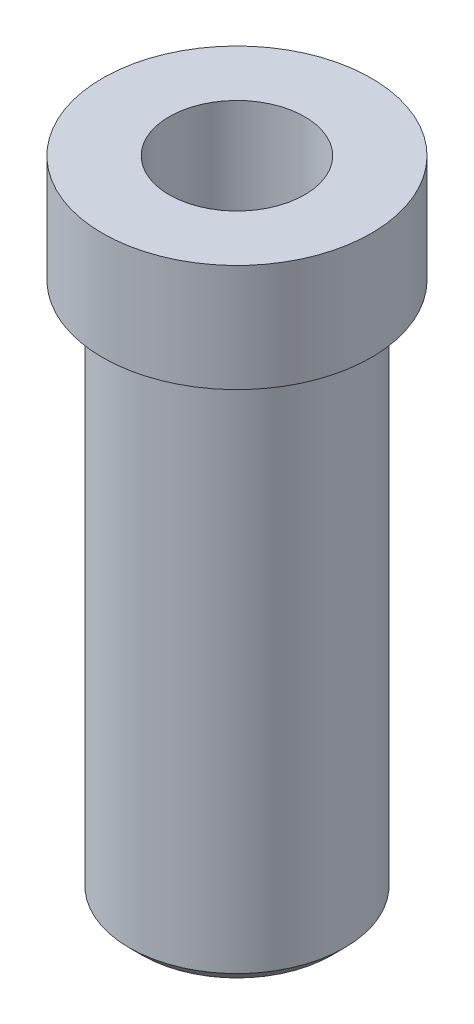
ISO-10303-21;
HEADER;
FILE_DESCRIPTION(('STEP AP214'),'2;1');
FILE_NAME('part.step','',(''),(''),'','','');
FILE_SCHEMA(('AUTOMOTIVE_DESIGN { 1 0 10303 214 1 1 1 1 }'));
ENDSEC;
DATA;
#1=APPLICATION_CONTEXT('core data for automotive mechanical design processes');
#2=APPLICATION_PROTOCOL_DEFINITION('international standard','automotive_design',2000,#1);
#3=PRODUCT_CONTEXT('',#1,'mechanical');
#4=PRODUCT('Part','Part','',(#3));
#5=PRODUCT_RELATED_PRODUCT_CATEGORY('part','',(#4));
#6=PRODUCT_DEFINITION_FORMATION('','',#4);
#7=PRODUCT_DEFINITION_CONTEXT('part definition',#1,'design');
#8=PRODUCT_DEFINITION('design','',#6,#7);
#9=PRODUCT_DEFINITION_SHAPE('','',#8);
#10=(LENGTH_UNIT() NAMED_UNIT(*) SI_UNIT(.MILLI.,.METRE.));
#11=(NAMED_UNIT(*) PLANE_ANGLE_UNIT() SI_UNIT($,.RADIAN.));
#12=(NAMED_UNIT(*) SI_UNIT($,.STERADIAN.) SOLID_ANGLE_UNIT());
#13=UNCERTAINTY_MEASURE_WITH_UNIT(LENGTH_MEASURE(1.E-05),#10,'distance_accuracy_value','');
#14=(GEOMETRIC_REPRESENTATION_CONTEXT(3) GLOBAL_UNCERTAINTY_ASSIGNED_CONTEXT((#13)) GLOBAL_UNIT_ASSIGNED_CONTEXT((#10,
#11,#12)) REPRESENTATION_CONTEXT('',''));
#15=CARTESIAN_POINT('',(0.,0.,0.));
#16=DIRECTION('',(0.,0.,1.));
#17=DIRECTION('',(1.,0.,0.));
#18=AXIS2_PLACEMENT_3D('',#15,#16,#17);
#19=CARTESIAN_POINT('',(0.,2.5,0.));
#20=DIRECTION('',(0.,-1.,0.));
#21=DIRECTION('',(0.,0.,-1.));
#22=AXIS2_PLACEMENT_3D('',#19,#20,#21);
#23=CYLINDRICAL_SURFACE('',#22,0.5);
#24=CARTESIAN_POINT('',(0.,0.0600000000000002,0.));
#25=DIRECTION('',(0.,1.,0.));
#26=DIRECTION('',(0.,0.,1.));
#27=AXIS2_PLACEMENT_3D('',#24,#25,#26);
#28=CIRCLE('',#27,0.5);
#29=CARTESIAN_POINT('',(0.,0.0600000000000002,0.5));
#30=VERTEX_POINT('',#29);
#31=EDGE_CURVE('E45',#30,#30,#28,.T.);
#32=ORIENTED_EDGE('',*,*,#31,.T.);
#33=EDGE_LOOP('',(#32));
#34=FACE_BOUND('',#33,.T.);
#35=CARTESIAN_POINT('',(0.,2.5,0.));
#36=DIRECTION('',(0.,1.,0.));
#37=DIRECTION('',(0.,0.,1.));
#38=AXIS2_PLACEMENT_3D('',#35,#36,#37);
#39=CIRCLE('',#38,0.5);
#40=CARTESIAN_POINT('',(0.,2.5,0.5));
#41=VERTEX_POINT('',#40);
#42=EDGE_CURVE('E49',#41,#41,#39,.T.);
#43=ORIENTED_EDGE('',*,*,#42,.F.);
#44=EDGE_LOOP('',(#43));
#45=FACE_BOUND('',#44,.T.);
#46=ADVANCED_FACE('F37',(#34,#45),#23,.T.);
#47=CARTESIAN_POINT('',(0.,0.,0.));
#48=DIRECTION('',(0.,1.,0.));
#49=DIRECTION('',(0.,0.,1.));
#50=AXIS2_PLACEMENT_3D('',#47,#48,#49);
#51=PLANE('',#50);
#52=CARTESIAN_POINT('',(0.,0.,0.));
#53=DIRECTION('',(0.,1.,0.));
#54=DIRECTION('',(0.,0.,1.));
#55=AXIS2_PLACEMENT_3D('',#52,#53,#54);
#56=CIRCLE('',#55,0.44);
#57=CARTESIAN_POINT('',(0.,0.,0.44));
#58=VERTEX_POINT('',#57);
#59=EDGE_CURVE('E10',#58,#58,#56,.F.);
#60=ORIENTED_EDGE('',*,*,#59,.T.);
#61=EDGE_LOOP('',(#60));
#62=FACE_BOUND('',#61,.T.);
#63=CARTESIAN_POINT('',(0.,0.,0.));
#64=DIRECTION('',(0.,1.,0.));
#65=DIRECTION('',(0.,0.,1.));
#66=AXIS2_PLACEMENT_3D('',#63,#64,#65);
#67=CIRCLE('',#66,0.314999999999997);
#68=CARTESIAN_POINT('',(0.,0.,0.314999999999997));
#69=VERTEX_POINT('',#68);
#70=EDGE_CURVE('E59',#69,#69,#67,.T.);
#71=ORIENTED_EDGE('',*,*,#70,.T.);
#72=EDGE_LOOP('',(#71));
#73=FACE_BOUND('',#72,.T.);
#74=ADVANCED_FACE('F80',(#62,#73),#51,.F.);
#75=CARTESIAN_POINT('',(0.,3.,0.));
#76=DIRECTION('',(0.,-1.,0.));
#77=DIRECTION('',(0.,0.,-1.));
#78=AXIS2_PLACEMENT_3D('',#75,#76,#77);
#79=CYLINDRICAL_SURFACE('',#78,0.625);
#80=CARTESIAN_POINT('',(0.,3.,0.));
#81=DIRECTION('',(0.,1.,0.));
#82=DIRECTION('',(0.,0.,1.));
#83=AXIS2_PLACEMENT_3D('',#80,#81,#82);
#84=CIRCLE('',#83,0.625);
#85=CARTESIAN_POINT('',(0.,3.,0.625));
#86=VERTEX_POINT('',#85);
#87=EDGE_CURVE('E53',#86,#86,#84,.T.);
#88=ORIENTED_EDGE('',*,*,#87,.F.);
#89=EDGE_LOOP('',(#88));
#90=FACE_BOUND('',#89,.T.);
#91=CARTESIAN_POINT('',(0.,2.5,0.));
#92=DIRECTION('',(0.,1.,0.));
#93=DIRECTION('',(0.,0.,1.));
#94=AXIS2_PLACEMENT_3D('',#91,#92,#93);
#95=CIRCLE('',#94,0.625);
#96=CARTESIAN_POINT('',(0.,2.5,0.625));
#97=VERTEX_POINT('',#96);
#98=EDGE_CURVE('E56',#97,#97,#95,.T.);
#99=ORIENTED_EDGE('',*,*,#98,.T.);
#100=EDGE_LOOP('',(#99));
#101=FACE_BOUND('',#100,.T.);
#102=ADVANCED_FACE('F74',(#90,#101),#79,.T.);
#103=CARTESIAN_POINT('',(0.,3.,0.));
#104=DIRECTION('',(0.,1.,0.));
#105=DIRECTION('',(0.,0.,1.));
#106=AXIS2_PLACEMENT_3D('',#103,#104,#105);
#107=PLANE('',#106);
#108=CARTESIAN_POINT('',(0.,3.,0.));
#109=DIRECTION('',(0.,1.,0.));
#110=DIRECTION('',(0.,0.,1.));
#111=AXIS2_PLACEMENT_3D('',#108,#109,#110);
#112=CIRCLE('',#111,0.314999999999987);
#113=CARTESIAN_POINT('',(0.,3.,0.314999999999987));
#114=VERTEX_POINT('',#113);
#115=EDGE_CURVE('E64',#114,#114,#112,.T.);
#116=ORIENTED_EDGE('',*,*,#115,.F.);
#117=EDGE_LOOP('',(#116));
#118=FACE_BOUND('',#117,.T.);
#119=ORIENTED_EDGE('',*,*,#87,.T.);
#120=EDGE_LOOP('',(#119));
#121=FACE_BOUND('',#120,.T.);
#122=ADVANCED_FACE('F70',(#118,#121),#107,.T.);
#123=CARTESIAN_POINT('',(0.,2.5,0.));
#124=DIRECTION('',(0.,1.,0.));
#125=DIRECTION('',(0.,0.,1.));
#126=AXIS2_PLACEMENT_3D('',#123,#124,#125);
#127=PLANE('',#126);
#128=ORIENTED_EDGE('',*,*,#42,.T.);
#129=EDGE_LOOP('',(#128));
#130=FACE_BOUND('',#129,.T.);
#131=ORIENTED_EDGE('',*,*,#98,.F.);
#132=EDGE_LOOP('',(#131));
#133=FACE_BOUND('',#132,.T.);
#134=ADVANCED_FACE('F73',(#130,#133),#127,.F.);
#135=CARTESIAN_POINT('',(0.,3.,0.));
#136=DIRECTION('',(0.,1.,0.));
#137=DIRECTION('',(0.,0.,1.));
#138=AXIS2_PLACEMENT_3D('',#135,#136,#137);
#139=CYLINDRICAL_SURFACE('',#138,0.314999999999992);
#140=ORIENTED_EDGE('',*,*,#70,.F.);
#141=EDGE_LOOP('',(#140));
#142=FACE_BOUND('',#141,.T.);
#143=ORIENTED_EDGE('',*,*,#115,.T.);
#144=EDGE_LOOP('',(#143));
#145=FACE_BOUND('',#144,.T.);
#146=ADVANCED_FACE('F68',(#142,#145),#139,.F.);
#147=CARTESIAN_POINT('',(0.,0.0600000000000002,0.));
#148=DIRECTION('',(0.,1.,0.));
#149=DIRECTION('',(0.,0.,1.));
#150=AXIS2_PLACEMENT_3D('',#147,#148,#149);
#151=CONICAL_SURFACE('',#150,0.5,0.785398163397448);
#152=ORIENTED_EDGE('',*,*,#59,.F.);
#153=EDGE_LOOP('',(#152));
#154=FACE_BOUND('',#153,.T.);
#155=ORIENTED_EDGE('',*,*,#31,.F.);
#156=EDGE_LOOP('',(#155));
#157=FACE_BOUND('',#156,.T.);
#158=ADVANCED_FACE('F40',(#154,#157),#151,.T.);
#159=CLOSED_SHELL('',(#46,#74,#102,#122,#134,#146,#158));
#160=MANIFOLD_SOLID_BREP('B2',#159);
#161=ADVANCED_BREP_SHAPE_REPRESENTATION('',(#18,#160),#14);
#162=SHAPE_DEFINITION_REPRESENTATION(#9,#161);
ENDSEC;
END-ISO-10303-21;
